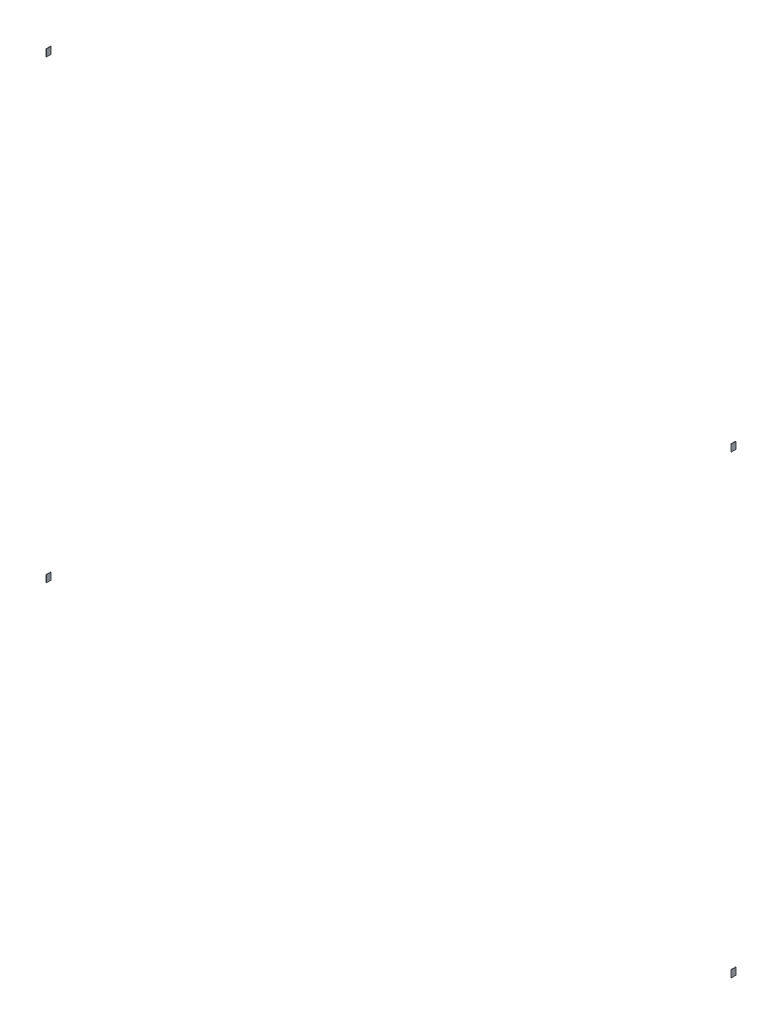
ISO-10303-21;
HEADER;
FILE_DESCRIPTION(('STEP AP214'),'2;1');
FILE_NAME('part.step','',(''),(''),'','','');
FILE_SCHEMA(('AUTOMOTIVE_DESIGN { 1 0 10303 214 1 1 1 1 }'));
ENDSEC;
DATA;
#1=APPLICATION_CONTEXT('core data for automotive mechanical design processes');
#2=APPLICATION_PROTOCOL_DEFINITION('international standard','automotive_design',2000,#1);
#3=PRODUCT_CONTEXT('',#1,'mechanical');
#4=PRODUCT('Part','Part','',(#3));
#5=PRODUCT_RELATED_PRODUCT_CATEGORY('part','',(#4));
#6=PRODUCT_DEFINITION_FORMATION('','',#4);
#7=PRODUCT_DEFINITION_CONTEXT('part definition',#1,'design');
#8=PRODUCT_DEFINITION('design','',#6,#7);
#9=PRODUCT_DEFINITION_SHAPE('','',#8);
#10=(LENGTH_UNIT() NAMED_UNIT(*) SI_UNIT(.MILLI.,.METRE.));
#11=(NAMED_UNIT(*) PLANE_ANGLE_UNIT() SI_UNIT($,.RADIAN.));
#12=(NAMED_UNIT(*) SI_UNIT($,.STERADIAN.) SOLID_ANGLE_UNIT());
#13=UNCERTAINTY_MEASURE_WITH_UNIT(LENGTH_MEASURE(1.E-05),#10,'distance_accuracy_value','');
#14=(GEOMETRIC_REPRESENTATION_CONTEXT(3) GLOBAL_UNCERTAINTY_ASSIGNED_CONTEXT((#13)) GLOBAL_UNIT_ASSIGNED_CONTEXT((#10,
#11,#12)) REPRESENTATION_CONTEXT('',''));
#15=CARTESIAN_POINT('',(0.,0.,0.));
#16=DIRECTION('',(0.,0.,1.));
#17=DIRECTION('',(1.,0.,0.));
#18=AXIS2_PLACEMENT_3D('',#15,#16,#17);
#19=CARTESIAN_POINT('',(-294.65,-196.,-43.));
#20=DIRECTION('',(0.,0.,1.));
#21=DIRECTION('',(1.,0.,0.));
#22=AXIS2_PLACEMENT_3D('',#19,#20,#21);
#23=PLANE('',#22);
#24=DIRECTION('',(-1.,0.,0.));
#25=VECTOR('',#24,1.);
#26=CARTESIAN_POINT('',(-294.65,-199.,-43.));
#27=LINE('',#26,#25);
#28=CARTESIAN_POINT('',(-294.5,-199.,-43.));
#29=VERTEX_POINT('',#28);
#30=CARTESIAN_POINT('',(-294.8,-199.,-43.));
#31=VERTEX_POINT('',#30);
#32=EDGE_CURVE('P0_E11',#29,#31,#27,.T.);
#33=ORIENTED_EDGE('',*,*,#32,.F.);
#34=DIRECTION('',(0.,-1.,0.));
#35=VECTOR('',#34,1.);
#36=CARTESIAN_POINT('',(-294.5,-196.,-43.));
#37=LINE('',#36,#35);
#38=CARTESIAN_POINT('',(-294.5,-193.,-43.));
#39=VERTEX_POINT('',#38);
#40=EDGE_CURVE('P0_E62',#39,#29,#37,.T.);
#41=ORIENTED_EDGE('',*,*,#40,.F.);
#42=DIRECTION('',(1.,0.,0.));
#43=VECTOR('',#42,1.);
#44=CARTESIAN_POINT('',(-294.65,-193.,-43.));
#45=LINE('',#44,#43);
#46=CARTESIAN_POINT('',(-294.8,-193.,-43.));
#47=VERTEX_POINT('',#46);
#48=EDGE_CURVE('P0_E99',#47,#39,#45,.T.);
#49=ORIENTED_EDGE('',*,*,#48,.F.);
#50=DIRECTION('',(0.,1.,0.));
#51=VECTOR('',#50,1.);
#52=CARTESIAN_POINT('',(-294.8,-196.,-43.));
#53=LINE('',#52,#51);
#54=EDGE_CURVE('P0_E25',#31,#47,#53,.T.);
#55=ORIENTED_EDGE('',*,*,#54,.F.);
#56=EDGE_LOOP('',(#33,#41,#49,#55));
#57=FACE_BOUND('',#56,.T.);
#58=ADVANCED_FACE('P0_F17',(#57),#23,.T.);
#59=CARTESIAN_POINT('',(-294.65,-199.,-47.));
#60=DIRECTION('',(0.,-1.,0.));
#61=DIRECTION('',(0.,0.,-1.));
#62=AXIS2_PLACEMENT_3D('',#59,#60,#61);
#63=PLANE('',#62);
#64=DIRECTION('',(0.,0.,1.));
#65=VECTOR('',#64,1.);
#66=CARTESIAN_POINT('',(-294.5,-199.,-47.));
#67=LINE('',#66,#65);
#68=CARTESIAN_POINT('',(-294.5,-199.,-47.));
#69=VERTEX_POINT('',#68);
#70=EDGE_CURVE('P0_E55',#69,#29,#67,.T.);
#71=ORIENTED_EDGE('',*,*,#70,.T.);
#72=ORIENTED_EDGE('',*,*,#32,.T.);
#73=DIRECTION('',(0.,0.,1.));
#74=VECTOR('',#73,1.);
#75=CARTESIAN_POINT('',(-294.8,-199.,-47.));
#76=LINE('',#75,#74);
#77=CARTESIAN_POINT('',(-294.8,-199.,-47.));
#78=VERTEX_POINT('',#77);
#79=EDGE_CURVE('P0_E69',#78,#31,#76,.T.);
#80=ORIENTED_EDGE('',*,*,#79,.F.);
#81=DIRECTION('',(1.,0.,0.));
#82=VECTOR('',#81,1.);
#83=CARTESIAN_POINT('',(-294.65,-199.,-47.));
#84=LINE('',#83,#82);
#85=EDGE_CURVE('P0_E67',#78,#69,#84,.T.);
#86=ORIENTED_EDGE('',*,*,#85,.T.);
#87=EDGE_LOOP('',(#71,#72,#80,#86));
#88=FACE_BOUND('',#87,.T.);
#89=ADVANCED_FACE('P0_F68',(#88),#63,.T.);
#90=CARTESIAN_POINT('',(-294.8,-196.,-47.));
#91=DIRECTION('',(-1.,0.,0.));
#92=DIRECTION('',(0.,0.,1.));
#93=AXIS2_PLACEMENT_3D('',#90,#91,#92);
#94=PLANE('',#93);
#95=ORIENTED_EDGE('',*,*,#79,.T.);
#96=ORIENTED_EDGE('',*,*,#54,.T.);
#97=DIRECTION('',(0.,0.,1.));
#98=VECTOR('',#97,1.);
#99=CARTESIAN_POINT('',(-294.8,-193.,-47.));
#100=LINE('',#99,#98);
#101=CARTESIAN_POINT('',(-294.8,-193.,-47.));
#102=VERTEX_POINT('',#101);
#103=EDGE_CURVE('P0_E91',#102,#47,#100,.T.);
#104=ORIENTED_EDGE('',*,*,#103,.F.);
#105=DIRECTION('',(0.,-1.,0.));
#106=VECTOR('',#105,1.);
#107=CARTESIAN_POINT('',(-294.8,-196.,-47.));
#108=LINE('',#107,#106);
#109=EDGE_CURVE('P0_E74',#102,#78,#108,.T.);
#110=ORIENTED_EDGE('',*,*,#109,.T.);
#111=EDGE_LOOP('',(#95,#96,#104,#110));
#112=FACE_BOUND('',#111,.T.);
#113=ADVANCED_FACE('P0_F106',(#112),#94,.T.);
#114=CARTESIAN_POINT('',(-294.65,-193.,-47.));
#115=DIRECTION('',(0.,1.,0.));
#116=DIRECTION('',(0.,0.,1.));
#117=AXIS2_PLACEMENT_3D('',#114,#115,#116);
#118=PLANE('',#117);
#119=ORIENTED_EDGE('',*,*,#103,.T.);
#120=ORIENTED_EDGE('',*,*,#48,.T.);
#121=DIRECTION('',(0.,0.,1.));
#122=VECTOR('',#121,1.);
#123=CARTESIAN_POINT('',(-294.5,-193.,-47.));
#124=LINE('',#123,#122);
#125=CARTESIAN_POINT('',(-294.5,-193.,-47.));
#126=VERTEX_POINT('',#125);
#127=EDGE_CURVE('P0_E64',#126,#39,#124,.T.);
#128=ORIENTED_EDGE('',*,*,#127,.F.);
#129=DIRECTION('',(-1.,0.,0.));
#130=VECTOR('',#129,1.);
#131=CARTESIAN_POINT('',(-294.65,-193.,-47.));
#132=LINE('',#131,#130);
#133=EDGE_CURVE('P0_E79',#126,#102,#132,.T.);
#134=ORIENTED_EDGE('',*,*,#133,.T.);
#135=EDGE_LOOP('',(#119,#120,#128,#134));
#136=FACE_BOUND('',#135,.T.);
#137=ADVANCED_FACE('P0_F104',(#136),#118,.T.);
#138=CARTESIAN_POINT('',(-294.65,-196.,-47.));
#139=DIRECTION('',(0.,0.,-1.));
#140=DIRECTION('',(-1.,0.,0.));
#141=AXIS2_PLACEMENT_3D('',#138,#139,#140);
#142=PLANE('',#141);
#143=DIRECTION('',(0.,1.,0.));
#144=VECTOR('',#143,1.);
#145=CARTESIAN_POINT('',(-294.5,-196.,-47.));
#146=LINE('',#145,#144);
#147=EDGE_CURVE('P0_E60',#69,#126,#146,.T.);
#148=ORIENTED_EDGE('',*,*,#147,.F.);
#149=ORIENTED_EDGE('',*,*,#85,.F.);
#150=ORIENTED_EDGE('',*,*,#109,.F.);
#151=ORIENTED_EDGE('',*,*,#133,.F.);
#152=EDGE_LOOP('',(#148,#149,#150,#151));
#153=FACE_BOUND('',#152,.T.);
#154=ADVANCED_FACE('P0_F77',(#153),#142,.T.);
#155=CARTESIAN_POINT('',(-294.5,-196.,-47.));
#156=DIRECTION('',(1.,0.,0.));
#157=DIRECTION('',(0.,0.,-1.));
#158=AXIS2_PLACEMENT_3D('',#155,#156,#157);
#159=PLANE('',#158);
#160=ORIENTED_EDGE('',*,*,#147,.T.);
#161=ORIENTED_EDGE('',*,*,#127,.T.);
#162=ORIENTED_EDGE('',*,*,#40,.T.);
#163=ORIENTED_EDGE('',*,*,#70,.F.);
#164=EDGE_LOOP('',(#160,#161,#162,#163));
#165=FACE_BOUND('',#164,.T.);
#166=ADVANCED_FACE('P0_F57',(#165),#159,.T.);
#167=CLOSED_SHELL('',(#58,#89,#113,#137,#154,#166));
#168=MANIFOLD_SOLID_BREP('P0_B1',#167);
#169=CARTESIAN_POINT('',(-294.65,196.,-43.));
#170=DIRECTION('',(0.,0.,1.));
#171=DIRECTION('',(1.,0.,0.));
#172=AXIS2_PLACEMENT_3D('',#169,#170,#171);
#173=PLANE('',#172);
#174=DIRECTION('',(-1.,0.,0.));
#175=VECTOR('',#174,1.);
#176=CARTESIAN_POINT('',(-294.65,193.,-43.));
#177=LINE('',#176,#175);
#178=CARTESIAN_POINT('',(-294.5,193.,-43.));
#179=VERTEX_POINT('',#178);
#180=CARTESIAN_POINT('',(-294.8,193.,-43.));
#181=VERTEX_POINT('',#180);
#182=EDGE_CURVE('P1_E11',#179,#181,#177,.T.);
#183=ORIENTED_EDGE('',*,*,#182,.F.);
#184=DIRECTION('',(0.,-1.,0.));
#185=VECTOR('',#184,1.);
#186=CARTESIAN_POINT('',(-294.5,196.,-43.));
#187=LINE('',#186,#185);
#188=CARTESIAN_POINT('',(-294.5,199.,-43.));
#189=VERTEX_POINT('',#188);
#190=EDGE_CURVE('P1_E62',#189,#179,#187,.T.);
#191=ORIENTED_EDGE('',*,*,#190,.F.);
#192=DIRECTION('',(1.,0.,0.));
#193=VECTOR('',#192,1.);
#194=CARTESIAN_POINT('',(-294.65,199.,-43.));
#195=LINE('',#194,#193);
#196=CARTESIAN_POINT('',(-294.8,199.,-43.));
#197=VERTEX_POINT('',#196);
#198=EDGE_CURVE('P1_E98',#197,#189,#195,.T.);
#199=ORIENTED_EDGE('',*,*,#198,.F.);
#200=DIRECTION('',(0.,1.,0.));
#201=VECTOR('',#200,1.);
#202=CARTESIAN_POINT('',(-294.8,196.,-43.));
#203=LINE('',#202,#201);
#204=EDGE_CURVE('P1_E25',#181,#197,#203,.T.);
#205=ORIENTED_EDGE('',*,*,#204,.F.);
#206=EDGE_LOOP('',(#183,#191,#199,#205));
#207=FACE_BOUND('',#206,.T.);
#208=ADVANCED_FACE('P1_F17',(#207),#173,.T.);
#209=CARTESIAN_POINT('',(-294.65,193.,-47.));
#210=DIRECTION('',(0.,-1.,0.));
#211=DIRECTION('',(0.,0.,-1.));
#212=AXIS2_PLACEMENT_3D('',#209,#210,#211);
#213=PLANE('',#212);
#214=DIRECTION('',(0.,0.,1.));
#215=VECTOR('',#214,1.);
#216=CARTESIAN_POINT('',(-294.5,193.,-47.));
#217=LINE('',#216,#215);
#218=CARTESIAN_POINT('',(-294.5,193.,-47.));
#219=VERTEX_POINT('',#218);
#220=EDGE_CURVE('P1_E55',#219,#179,#217,.T.);
#221=ORIENTED_EDGE('',*,*,#220,.T.);
#222=ORIENTED_EDGE('',*,*,#182,.T.);
#223=DIRECTION('',(0.,0.,1.));
#224=VECTOR('',#223,1.);
#225=CARTESIAN_POINT('',(-294.8,193.,-47.));
#226=LINE('',#225,#224);
#227=CARTESIAN_POINT('',(-294.8,193.,-47.));
#228=VERTEX_POINT('',#227);
#229=EDGE_CURVE('P1_E69',#228,#181,#226,.T.);
#230=ORIENTED_EDGE('',*,*,#229,.F.);
#231=DIRECTION('',(1.,0.,0.));
#232=VECTOR('',#231,1.);
#233=CARTESIAN_POINT('',(-294.65,193.,-47.));
#234=LINE('',#233,#232);
#235=EDGE_CURVE('P1_E67',#228,#219,#234,.T.);
#236=ORIENTED_EDGE('',*,*,#235,.T.);
#237=EDGE_LOOP('',(#221,#222,#230,#236));
#238=FACE_BOUND('',#237,.T.);
#239=ADVANCED_FACE('P1_F68',(#238),#213,.T.);
#240=CARTESIAN_POINT('',(-294.8,196.,-47.));
#241=DIRECTION('',(-1.,0.,0.));
#242=DIRECTION('',(0.,0.,1.));
#243=AXIS2_PLACEMENT_3D('',#240,#241,#242);
#244=PLANE('',#243);
#245=ORIENTED_EDGE('',*,*,#229,.T.);
#246=ORIENTED_EDGE('',*,*,#204,.T.);
#247=DIRECTION('',(0.,0.,1.));
#248=VECTOR('',#247,1.);
#249=CARTESIAN_POINT('',(-294.8,199.,-47.));
#250=LINE('',#249,#248);
#251=CARTESIAN_POINT('',(-294.8,199.,-47.));
#252=VERTEX_POINT('',#251);
#253=EDGE_CURVE('P1_E91',#252,#197,#250,.T.);
#254=ORIENTED_EDGE('',*,*,#253,.F.);
#255=DIRECTION('',(0.,-1.,0.));
#256=VECTOR('',#255,1.);
#257=CARTESIAN_POINT('',(-294.8,196.,-47.));
#258=LINE('',#257,#256);
#259=EDGE_CURVE('P1_E74',#252,#228,#258,.T.);
#260=ORIENTED_EDGE('',*,*,#259,.T.);
#261=EDGE_LOOP('',(#245,#246,#254,#260));
#262=FACE_BOUND('',#261,.T.);
#263=ADVANCED_FACE('P1_F106',(#262),#244,.T.);
#264=CARTESIAN_POINT('',(-294.65,199.,-47.));
#265=DIRECTION('',(0.,1.,0.));
#266=DIRECTION('',(0.,0.,1.));
#267=AXIS2_PLACEMENT_3D('',#264,#265,#266);
#268=PLANE('',#267);
#269=ORIENTED_EDGE('',*,*,#253,.T.);
#270=ORIENTED_EDGE('',*,*,#198,.T.);
#271=DIRECTION('',(0.,0.,1.));
#272=VECTOR('',#271,1.);
#273=CARTESIAN_POINT('',(-294.5,199.,-47.));
#274=LINE('',#273,#272);
#275=CARTESIAN_POINT('',(-294.5,199.,-47.));
#276=VERTEX_POINT('',#275);
#277=EDGE_CURVE('P1_E64',#276,#189,#274,.T.);
#278=ORIENTED_EDGE('',*,*,#277,.F.);
#279=DIRECTION('',(-1.,0.,0.));
#280=VECTOR('',#279,1.);
#281=CARTESIAN_POINT('',(-294.65,199.,-47.));
#282=LINE('',#281,#280);
#283=EDGE_CURVE('P1_E79',#276,#252,#282,.T.);
#284=ORIENTED_EDGE('',*,*,#283,.T.);
#285=EDGE_LOOP('',(#269,#270,#278,#284));
#286=FACE_BOUND('',#285,.T.);
#287=ADVANCED_FACE('P1_F104',(#286),#268,.T.);
#288=CARTESIAN_POINT('',(-294.65,196.,-47.));
#289=DIRECTION('',(0.,0.,-1.));
#290=DIRECTION('',(-1.,0.,0.));
#291=AXIS2_PLACEMENT_3D('',#288,#289,#290);
#292=PLANE('',#291);
#293=DIRECTION('',(0.,1.,0.));
#294=VECTOR('',#293,1.);
#295=CARTESIAN_POINT('',(-294.5,196.,-47.));
#296=LINE('',#295,#294);
#297=EDGE_CURVE('P1_E60',#219,#276,#296,.T.);
#298=ORIENTED_EDGE('',*,*,#297,.F.);
#299=ORIENTED_EDGE('',*,*,#235,.F.);
#300=ORIENTED_EDGE('',*,*,#259,.F.);
#301=ORIENTED_EDGE('',*,*,#283,.F.);
#302=EDGE_LOOP('',(#298,#299,#300,#301));
#303=FACE_BOUND('',#302,.T.);
#304=ADVANCED_FACE('P1_F77',(#303),#292,.T.);
#305=CARTESIAN_POINT('',(-294.5,196.,-47.));
#306=DIRECTION('',(1.,0.,0.));
#307=DIRECTION('',(0.,0.,-1.));
#308=AXIS2_PLACEMENT_3D('',#305,#306,#307);
#309=PLANE('',#308);
#310=ORIENTED_EDGE('',*,*,#297,.T.);
#311=ORIENTED_EDGE('',*,*,#277,.T.);
#312=ORIENTED_EDGE('',*,*,#190,.T.);
#313=ORIENTED_EDGE('',*,*,#220,.F.);
#314=EDGE_LOOP('',(#310,#311,#312,#313));
#315=FACE_BOUND('',#314,.T.);
#316=ADVANCED_FACE('P1_F57',(#315),#309,.T.);
#317=CLOSED_SHELL('',(#208,#239,#263,#287,#304,#316));
#318=MANIFOLD_SOLID_BREP('P1_B1',#317);
#319=CARTESIAN_POINT('',(294.65,-196.,-43.));
#320=DIRECTION('',(0.,0.,1.));
#321=DIRECTION('',(1.,0.,0.));
#322=AXIS2_PLACEMENT_3D('',#319,#320,#321);
#323=PLANE('',#322);
#324=DIRECTION('',(-1.,0.,0.));
#325=VECTOR('',#324,1.);
#326=CARTESIAN_POINT('',(294.65,-199.,-43.));
#327=LINE('',#326,#325);
#328=CARTESIAN_POINT('',(294.8,-199.,-43.));
#329=VERTEX_POINT('',#328);
#330=CARTESIAN_POINT('',(294.5,-199.,-43.));
#331=VERTEX_POINT('',#330);
#332=EDGE_CURVE('P2_E11',#329,#331,#327,.T.);
#333=ORIENTED_EDGE('',*,*,#332,.F.);
#334=DIRECTION('',(0.,-1.,0.));
#335=VECTOR('',#334,1.);
#336=CARTESIAN_POINT('',(294.8,-196.,-43.));
#337=LINE('',#336,#335);
#338=CARTESIAN_POINT('',(294.8,-193.,-43.));
#339=VERTEX_POINT('',#338);
#340=EDGE_CURVE('P2_E62',#339,#329,#337,.T.);
#341=ORIENTED_EDGE('',*,*,#340,.F.);
#342=DIRECTION('',(1.,0.,0.));
#343=VECTOR('',#342,1.);
#344=CARTESIAN_POINT('',(294.65,-193.,-43.));
#345=LINE('',#344,#343);
#346=CARTESIAN_POINT('',(294.5,-193.,-43.));
#347=VERTEX_POINT('',#346);
#348=EDGE_CURVE('P2_E98',#347,#339,#345,.T.);
#349=ORIENTED_EDGE('',*,*,#348,.F.);
#350=DIRECTION('',(0.,1.,0.));
#351=VECTOR('',#350,1.);
#352=CARTESIAN_POINT('',(294.5,-196.,-43.));
#353=LINE('',#352,#351);
#354=EDGE_CURVE('P2_E25',#331,#347,#353,.T.);
#355=ORIENTED_EDGE('',*,*,#354,.F.);
#356=EDGE_LOOP('',(#333,#341,#349,#355));
#357=FACE_BOUND('',#356,.T.);
#358=ADVANCED_FACE('P2_F17',(#357),#323,.T.);
#359=CARTESIAN_POINT('',(294.65,-199.,-47.));
#360=DIRECTION('',(0.,-1.,0.));
#361=DIRECTION('',(0.,0.,-1.));
#362=AXIS2_PLACEMENT_3D('',#359,#360,#361);
#363=PLANE('',#362);
#364=DIRECTION('',(0.,0.,1.));
#365=VECTOR('',#364,1.);
#366=CARTESIAN_POINT('',(294.8,-199.,-47.));
#367=LINE('',#366,#365);
#368=CARTESIAN_POINT('',(294.8,-199.,-47.));
#369=VERTEX_POINT('',#368);
#370=EDGE_CURVE('P2_E55',#369,#329,#367,.T.);
#371=ORIENTED_EDGE('',*,*,#370,.T.);
#372=ORIENTED_EDGE('',*,*,#332,.T.);
#373=DIRECTION('',(0.,0.,1.));
#374=VECTOR('',#373,1.);
#375=CARTESIAN_POINT('',(294.5,-199.,-47.));
#376=LINE('',#375,#374);
#377=CARTESIAN_POINT('',(294.5,-199.,-47.));
#378=VERTEX_POINT('',#377);
#379=EDGE_CURVE('P2_E69',#378,#331,#376,.T.);
#380=ORIENTED_EDGE('',*,*,#379,.F.);
#381=DIRECTION('',(1.,0.,0.));
#382=VECTOR('',#381,1.);
#383=CARTESIAN_POINT('',(294.65,-199.,-47.));
#384=LINE('',#383,#382);
#385=EDGE_CURVE('P2_E67',#378,#369,#384,.T.);
#386=ORIENTED_EDGE('',*,*,#385,.T.);
#387=EDGE_LOOP('',(#371,#372,#380,#386));
#388=FACE_BOUND('',#387,.T.);
#389=ADVANCED_FACE('P2_F68',(#388),#363,.T.);
#390=CARTESIAN_POINT('',(294.5,-196.,-47.));
#391=DIRECTION('',(-1.,0.,0.));
#392=DIRECTION('',(0.,0.,1.));
#393=AXIS2_PLACEMENT_3D('',#390,#391,#392);
#394=PLANE('',#393);
#395=ORIENTED_EDGE('',*,*,#379,.T.);
#396=ORIENTED_EDGE('',*,*,#354,.T.);
#397=DIRECTION('',(0.,0.,1.));
#398=VECTOR('',#397,1.);
#399=CARTESIAN_POINT('',(294.5,-193.,-47.));
#400=LINE('',#399,#398);
#401=CARTESIAN_POINT('',(294.5,-193.,-47.));
#402=VERTEX_POINT('',#401);
#403=EDGE_CURVE('P2_E90',#402,#347,#400,.T.);
#404=ORIENTED_EDGE('',*,*,#403,.F.);
#405=DIRECTION('',(0.,-1.,0.));
#406=VECTOR('',#405,1.);
#407=CARTESIAN_POINT('',(294.5,-196.,-47.));
#408=LINE('',#407,#406);
#409=EDGE_CURVE('P2_E74',#402,#378,#408,.T.);
#410=ORIENTED_EDGE('',*,*,#409,.T.);
#411=EDGE_LOOP('',(#395,#396,#404,#410));
#412=FACE_BOUND('',#411,.T.);
#413=ADVANCED_FACE('P2_F106',(#412),#394,.T.);
#414=CARTESIAN_POINT('',(294.65,-193.,-47.));
#415=DIRECTION('',(0.,1.,0.));
#416=DIRECTION('',(0.,0.,1.));
#417=AXIS2_PLACEMENT_3D('',#414,#415,#416);
#418=PLANE('',#417);
#419=ORIENTED_EDGE('',*,*,#403,.T.);
#420=ORIENTED_EDGE('',*,*,#348,.T.);
#421=DIRECTION('',(0.,0.,1.));
#422=VECTOR('',#421,1.);
#423=CARTESIAN_POINT('',(294.8,-193.,-47.));
#424=LINE('',#423,#422);
#425=CARTESIAN_POINT('',(294.8,-193.,-47.));
#426=VERTEX_POINT('',#425);
#427=EDGE_CURVE('P2_E64',#426,#339,#424,.T.);
#428=ORIENTED_EDGE('',*,*,#427,.F.);
#429=DIRECTION('',(-1.,0.,0.));
#430=VECTOR('',#429,1.);
#431=CARTESIAN_POINT('',(294.65,-193.,-47.));
#432=LINE('',#431,#430);
#433=EDGE_CURVE('P2_E79',#426,#402,#432,.T.);
#434=ORIENTED_EDGE('',*,*,#433,.T.);
#435=EDGE_LOOP('',(#419,#420,#428,#434));
#436=FACE_BOUND('',#435,.T.);
#437=ADVANCED_FACE('P2_F104',(#436),#418,.T.);
#438=CARTESIAN_POINT('',(294.65,-196.,-47.));
#439=DIRECTION('',(0.,0.,-1.));
#440=DIRECTION('',(-1.,0.,0.));
#441=AXIS2_PLACEMENT_3D('',#438,#439,#440);
#442=PLANE('',#441);
#443=DIRECTION('',(0.,1.,0.));
#444=VECTOR('',#443,1.);
#445=CARTESIAN_POINT('',(294.8,-196.,-47.));
#446=LINE('',#445,#444);
#447=EDGE_CURVE('P2_E60',#369,#426,#446,.T.);
#448=ORIENTED_EDGE('',*,*,#447,.F.);
#449=ORIENTED_EDGE('',*,*,#385,.F.);
#450=ORIENTED_EDGE('',*,*,#409,.F.);
#451=ORIENTED_EDGE('',*,*,#433,.F.);
#452=EDGE_LOOP('',(#448,#449,#450,#451));
#453=FACE_BOUND('',#452,.T.);
#454=ADVANCED_FACE('P2_F77',(#453),#442,.T.);
#455=CARTESIAN_POINT('',(294.8,-196.,-47.));
#456=DIRECTION('',(1.,0.,0.));
#457=DIRECTION('',(0.,0.,-1.));
#458=AXIS2_PLACEMENT_3D('',#455,#456,#457);
#459=PLANE('',#458);
#460=ORIENTED_EDGE('',*,*,#447,.T.);
#461=ORIENTED_EDGE('',*,*,#427,.T.);
#462=ORIENTED_EDGE('',*,*,#340,.T.);
#463=ORIENTED_EDGE('',*,*,#370,.F.);
#464=EDGE_LOOP('',(#460,#461,#462,#463));
#465=FACE_BOUND('',#464,.T.);
#466=ADVANCED_FACE('P2_F57',(#465),#459,.T.);
#467=CLOSED_SHELL('',(#358,#389,#413,#437,#454,#466));
#468=MANIFOLD_SOLID_BREP('P2_B1',#467);
#469=CARTESIAN_POINT('',(294.65,196.,-43.));
#470=DIRECTION('',(0.,0.,1.));
#471=DIRECTION('',(1.,0.,0.));
#472=AXIS2_PLACEMENT_3D('',#469,#470,#471);
#473=PLANE('',#472);
#474=DIRECTION('',(-1.,0.,0.));
#475=VECTOR('',#474,1.);
#476=CARTESIAN_POINT('',(294.65,193.,-43.));
#477=LINE('',#476,#475);
#478=CARTESIAN_POINT('',(294.8,193.,-43.));
#479=VERTEX_POINT('',#478);
#480=CARTESIAN_POINT('',(294.5,193.,-43.));
#481=VERTEX_POINT('',#480);
#482=EDGE_CURVE('P3_E11',#479,#481,#477,.T.);
#483=ORIENTED_EDGE('',*,*,#482,.F.);
#484=DIRECTION('',(0.,-1.,0.));
#485=VECTOR('',#484,1.);
#486=CARTESIAN_POINT('',(294.8,196.,-43.));
#487=LINE('',#486,#485);
#488=CARTESIAN_POINT('',(294.8,199.,-43.));
#489=VERTEX_POINT('',#488);
#490=EDGE_CURVE('P3_E62',#489,#479,#487,.T.);
#491=ORIENTED_EDGE('',*,*,#490,.F.);
#492=DIRECTION('',(1.,0.,0.));
#493=VECTOR('',#492,1.);
#494=CARTESIAN_POINT('',(294.65,199.,-43.));
#495=LINE('',#494,#493);
#496=CARTESIAN_POINT('',(294.5,199.,-43.));
#497=VERTEX_POINT('',#496);
#498=EDGE_CURVE('P3_E98',#497,#489,#495,.T.);
#499=ORIENTED_EDGE('',*,*,#498,.F.);
#500=DIRECTION('',(0.,1.,0.));
#501=VECTOR('',#500,1.);
#502=CARTESIAN_POINT('',(294.5,196.,-43.));
#503=LINE('',#502,#501);
#504=EDGE_CURVE('P3_E25',#481,#497,#503,.T.);
#505=ORIENTED_EDGE('',*,*,#504,.F.);
#506=EDGE_LOOP('',(#483,#491,#499,#505));
#507=FACE_BOUND('',#506,.T.);
#508=ADVANCED_FACE('P3_F17',(#507),#473,.T.);
#509=CARTESIAN_POINT('',(294.65,193.,-47.));
#510=DIRECTION('',(0.,-1.,0.));
#511=DIRECTION('',(0.,0.,-1.));
#512=AXIS2_PLACEMENT_3D('',#509,#510,#511);
#513=PLANE('',#512);
#514=DIRECTION('',(0.,0.,1.));
#515=VECTOR('',#514,1.);
#516=CARTESIAN_POINT('',(294.8,193.,-47.));
#517=LINE('',#516,#515);
#518=CARTESIAN_POINT('',(294.8,193.,-47.));
#519=VERTEX_POINT('',#518);
#520=EDGE_CURVE('P3_E55',#519,#479,#517,.T.);
#521=ORIENTED_EDGE('',*,*,#520,.T.);
#522=ORIENTED_EDGE('',*,*,#482,.T.);
#523=DIRECTION('',(0.,0.,1.));
#524=VECTOR('',#523,1.);
#525=CARTESIAN_POINT('',(294.5,193.,-47.));
#526=LINE('',#525,#524);
#527=CARTESIAN_POINT('',(294.5,193.,-47.));
#528=VERTEX_POINT('',#527);
#529=EDGE_CURVE('P3_E69',#528,#481,#526,.T.);
#530=ORIENTED_EDGE('',*,*,#529,.F.);
#531=DIRECTION('',(1.,0.,0.));
#532=VECTOR('',#531,1.);
#533=CARTESIAN_POINT('',(294.65,193.,-47.));
#534=LINE('',#533,#532);
#535=EDGE_CURVE('P3_E67',#528,#519,#534,.T.);
#536=ORIENTED_EDGE('',*,*,#535,.T.);
#537=EDGE_LOOP('',(#521,#522,#530,#536));
#538=FACE_BOUND('',#537,.T.);
#539=ADVANCED_FACE('P3_F68',(#538),#513,.T.);
#540=CARTESIAN_POINT('',(294.5,196.,-47.));
#541=DIRECTION('',(-1.,0.,0.));
#542=DIRECTION('',(0.,0.,1.));
#543=AXIS2_PLACEMENT_3D('',#540,#541,#542);
#544=PLANE('',#543);
#545=ORIENTED_EDGE('',*,*,#529,.T.);
#546=ORIENTED_EDGE('',*,*,#504,.T.);
#547=DIRECTION('',(0.,0.,1.));
#548=VECTOR('',#547,1.);
#549=CARTESIAN_POINT('',(294.5,199.,-47.));
#550=LINE('',#549,#548);
#551=CARTESIAN_POINT('',(294.5,199.,-47.));
#552=VERTEX_POINT('',#551);
#553=EDGE_CURVE('P3_E90',#552,#497,#550,.T.);
#554=ORIENTED_EDGE('',*,*,#553,.F.);
#555=DIRECTION('',(0.,-1.,0.));
#556=VECTOR('',#555,1.);
#557=CARTESIAN_POINT('',(294.5,196.,-47.));
#558=LINE('',#557,#556);
#559=EDGE_CURVE('P3_E74',#552,#528,#558,.T.);
#560=ORIENTED_EDGE('',*,*,#559,.T.);
#561=EDGE_LOOP('',(#545,#546,#554,#560));
#562=FACE_BOUND('',#561,.T.);
#563=ADVANCED_FACE('P3_F106',(#562),#544,.T.);
#564=CARTESIAN_POINT('',(294.65,199.,-47.));
#565=DIRECTION('',(0.,1.,0.));
#566=DIRECTION('',(0.,0.,1.));
#567=AXIS2_PLACEMENT_3D('',#564,#565,#566);
#568=PLANE('',#567);
#569=ORIENTED_EDGE('',*,*,#553,.T.);
#570=ORIENTED_EDGE('',*,*,#498,.T.);
#571=DIRECTION('',(0.,0.,1.));
#572=VECTOR('',#571,1.);
#573=CARTESIAN_POINT('',(294.8,199.,-47.));
#574=LINE('',#573,#572);
#575=CARTESIAN_POINT('',(294.8,199.,-47.));
#576=VERTEX_POINT('',#575);
#577=EDGE_CURVE('P3_E64',#576,#489,#574,.T.);
#578=ORIENTED_EDGE('',*,*,#577,.F.);
#579=DIRECTION('',(-1.,0.,0.));
#580=VECTOR('',#579,1.);
#581=CARTESIAN_POINT('',(294.65,199.,-47.));
#582=LINE('',#581,#580);
#583=EDGE_CURVE('P3_E79',#576,#552,#582,.T.);
#584=ORIENTED_EDGE('',*,*,#583,.T.);
#585=EDGE_LOOP('',(#569,#570,#578,#584));
#586=FACE_BOUND('',#585,.T.);
#587=ADVANCED_FACE('P3_F104',(#586),#568,.T.);
#588=CARTESIAN_POINT('',(294.65,196.,-47.));
#589=DIRECTION('',(0.,0.,-1.));
#590=DIRECTION('',(-1.,0.,0.));
#591=AXIS2_PLACEMENT_3D('',#588,#589,#590);
#592=PLANE('',#591);
#593=DIRECTION('',(0.,1.,0.));
#594=VECTOR('',#593,1.);
#595=CARTESIAN_POINT('',(294.8,196.,-47.));
#596=LINE('',#595,#594);
#597=EDGE_CURVE('P3_E60',#519,#576,#596,.T.);
#598=ORIENTED_EDGE('',*,*,#597,.F.);
#599=ORIENTED_EDGE('',*,*,#535,.F.);
#600=ORIENTED_EDGE('',*,*,#559,.F.);
#601=ORIENTED_EDGE('',*,*,#583,.F.);
#602=EDGE_LOOP('',(#598,#599,#600,#601));
#603=FACE_BOUND('',#602,.T.);
#604=ADVANCED_FACE('P3_F77',(#603),#592,.T.);
#605=CARTESIAN_POINT('',(294.8,196.,-47.));
#606=DIRECTION('',(1.,0.,0.));
#607=DIRECTION('',(0.,0.,-1.));
#608=AXIS2_PLACEMENT_3D('',#605,#606,#607);
#609=PLANE('',#608);
#610=ORIENTED_EDGE('',*,*,#597,.T.);
#611=ORIENTED_EDGE('',*,*,#577,.T.);
#612=ORIENTED_EDGE('',*,*,#490,.T.);
#613=ORIENTED_EDGE('',*,*,#520,.F.);
#614=EDGE_LOOP('',(#610,#611,#612,#613));
#615=FACE_BOUND('',#614,.T.);
#616=ADVANCED_FACE('P3_F57',(#615),#609,.T.);
#617=CLOSED_SHELL('',(#508,#539,#563,#587,#604,#616));
#618=MANIFOLD_SOLID_BREP('P3_B1',#617);
#619=ADVANCED_BREP_SHAPE_REPRESENTATION('',(#18,#168,#318,#468,#618),#14);
#620=SHAPE_DEFINITION_REPRESENTATION(#9,#619);
ENDSEC;
END-ISO-10303-21;
